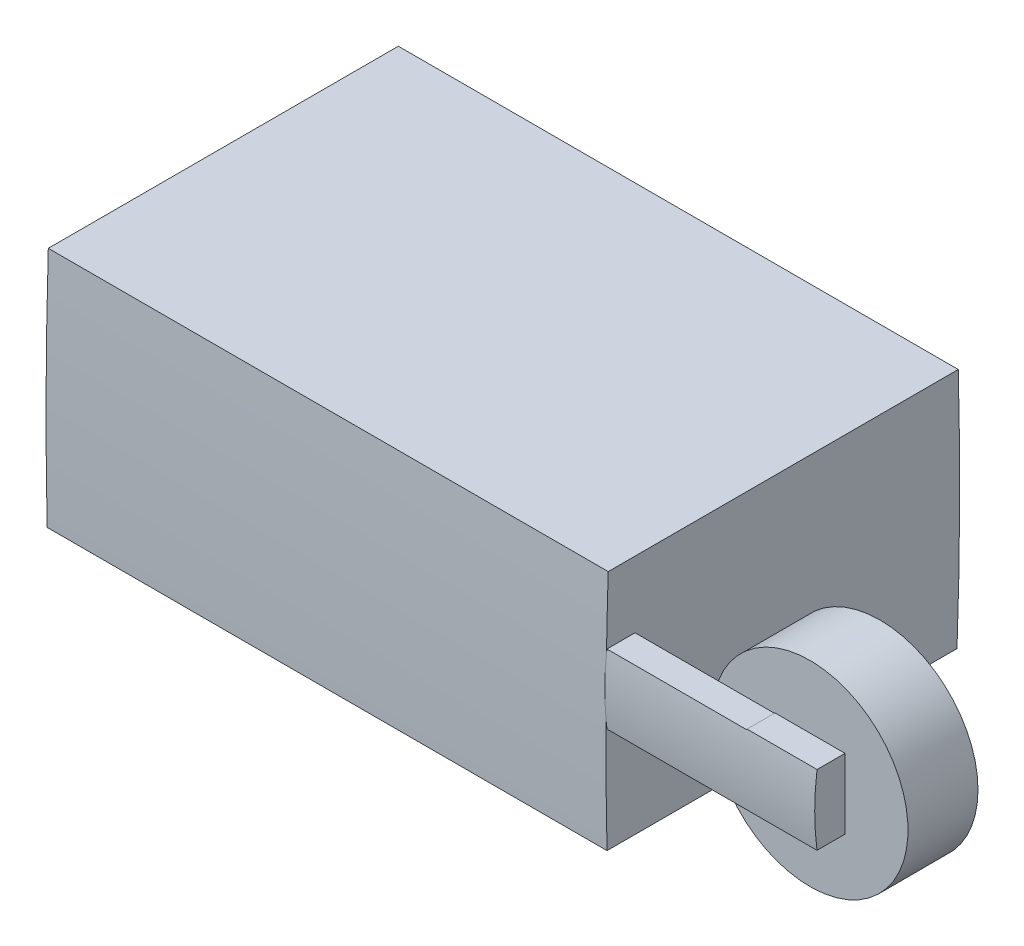
ISO-10303-21;
HEADER;
FILE_DESCRIPTION(('STEP AP214'),'2;1');
FILE_NAME('part.step','',(''),(''),'','','');
FILE_SCHEMA(('AUTOMOTIVE_DESIGN { 1 0 10303 214 1 1 1 1 }'));
ENDSEC;
DATA;
#1=APPLICATION_CONTEXT('core data for automotive mechanical design processes');
#2=APPLICATION_PROTOCOL_DEFINITION('international standard','automotive_design',2000,#1);
#3=PRODUCT_CONTEXT('',#1,'mechanical');
#4=PRODUCT('Part','Part','',(#3));
#5=PRODUCT_RELATED_PRODUCT_CATEGORY('part','',(#4));
#6=PRODUCT_DEFINITION_FORMATION('','',#4);
#7=PRODUCT_DEFINITION_CONTEXT('part definition',#1,'design');
#8=PRODUCT_DEFINITION('design','',#6,#7);
#9=PRODUCT_DEFINITION_SHAPE('','',#8);
#10=(LENGTH_UNIT() NAMED_UNIT(*) SI_UNIT(.MILLI.,.METRE.));
#11=(NAMED_UNIT(*) PLANE_ANGLE_UNIT() SI_UNIT($,.RADIAN.));
#12=(NAMED_UNIT(*) SI_UNIT($,.STERADIAN.) SOLID_ANGLE_UNIT());
#13=UNCERTAINTY_MEASURE_WITH_UNIT(LENGTH_MEASURE(1.E-05),#10,'distance_accuracy_value','');
#14=(GEOMETRIC_REPRESENTATION_CONTEXT(3) GLOBAL_UNCERTAINTY_ASSIGNED_CONTEXT((#13)) GLOBAL_UNIT_ASSIGNED_CONTEXT((#10,
#11,#12)) REPRESENTATION_CONTEXT('',''));
#15=CARTESIAN_POINT('',(0.,0.,0.));
#16=DIRECTION('',(0.,0.,1.));
#17=DIRECTION('',(1.,0.,0.));
#18=AXIS2_PLACEMENT_3D('',#15,#16,#17);
#19=CARTESIAN_POINT('',(0.,0.,10.));
#20=DIRECTION('',(0.,0.,1.));
#21=DIRECTION('',(1.,0.,0.));
#22=AXIS2_PLACEMENT_3D('',#19,#20,#21);
#23=PLANE('',#22);
#24=DIRECTION('',(1.,0.,0.));
#25=VECTOR('',#24,1.);
#26=CARTESIAN_POINT('',(-5.,-5.,10.));
#27=LINE('',#26,#25);
#28=CARTESIAN_POINT('',(-13.076696830622,-5.,10.));
#29=VERTEX_POINT('',#28);
#30=CARTESIAN_POINT('',(5.,-5.,10.));
#31=VERTEX_POINT('',#30);
#32=EDGE_CURVE('E200',#29,#31,#27,.T.);
#33=ORIENTED_EDGE('',*,*,#32,.F.);
#34=CARTESIAN_POINT('',(0.,0.,10.));
#35=DIRECTION('',(0.,0.,1.));
#36=DIRECTION('',(1.,0.,0.));
#37=AXIS2_PLACEMENT_3D('',#34,#35,#36);
#38=CIRCLE('',#37,14.);
#39=CARTESIAN_POINT('',(-13.1096817143984,4.91286528892942,10.));
#40=VERTEX_POINT('',#39);
#41=EDGE_CURVE('E220',#29,#40,#38,.T.);
#42=ORIENTED_EDGE('',*,*,#41,.T.);
#43=DIRECTION('',(1.,0.,0.));
#44=VECTOR('',#43,1.);
#45=CARTESIAN_POINT('',(-25.,4.91286528892942,10.));
#46=LINE('',#45,#44);
#47=CARTESIAN_POINT('',(-5.,4.91286528892942,10.));
#48=VERTEX_POINT('',#47);
#49=EDGE_CURVE('E183',#40,#48,#46,.T.);
#50=ORIENTED_EDGE('',*,*,#49,.T.);
#51=DIRECTION('',(0.,-1.,0.));
#52=VECTOR('',#51,1.);
#53=CARTESIAN_POINT('',(-5.,5.,10.));
#54=LINE('',#53,#52);
#55=CARTESIAN_POINT('',(-5.,5.,10.));
#56=VERTEX_POINT('',#55);
#57=EDGE_CURVE('E197',#56,#48,#54,.T.);
#58=ORIENTED_EDGE('',*,*,#57,.F.);
#59=DIRECTION('',(-1.,0.,0.));
#60=VECTOR('',#59,1.);
#61=CARTESIAN_POINT('',(-5.,5.,10.));
#62=LINE('',#61,#60);
#63=CARTESIAN_POINT('',(5.,5.,10.));
#64=VERTEX_POINT('',#63);
#65=EDGE_CURVE('E194',#64,#56,#62,.T.);
#66=ORIENTED_EDGE('',*,*,#65,.F.);
#67=DIRECTION('',(0.,1.,0.));
#68=VECTOR('',#67,1.);
#69=CARTESIAN_POINT('',(5.,5.,10.));
#70=LINE('',#69,#68);
#71=EDGE_CURVE('E191',#31,#64,#70,.T.);
#72=ORIENTED_EDGE('',*,*,#71,.F.);
#73=EDGE_LOOP('',(#33,#42,#50,#58,#66,#72));
#74=FACE_BOUND('',#73,.T.);
#75=ADVANCED_FACE('F35',(#74),#23,.T.);
#76=CARTESIAN_POINT('',(-5.,5.,18.));
#77=DIRECTION('',(1.,0.,0.));
#78=DIRECTION('',(0.,1.,0.));
#79=AXIS2_PLACEMENT_3D('',#76,#77,#78);
#80=PLANE('',#79);
#81=DIRECTION('',(0.,0.,-1.));
#82=VECTOR('',#81,1.);
#83=CARTESIAN_POINT('',(-5.,4.91286528892942,10.));
#84=LINE('',#83,#82);
#85=CARTESIAN_POINT('',(-5.,4.91286528892942,14.0114631277404));
#86=VERTEX_POINT('',#85);
#87=EDGE_CURVE('E173',#86,#48,#84,.T.);
#88=ORIENTED_EDGE('',*,*,#87,.F.);
#89=CARTESIAN_POINT('',(-5.,0.,-23.6696164036747));
#90=DIRECTION('',(1.,0.,0.));
#91=DIRECTION('',(0.,1.,0.));
#92=AXIS2_PLACEMENT_3D('',#89,#90,#91);
#93=CIRCLE('',#92,38.);
#94=CARTESIAN_POINT('',(-5.,5.,14.));
#95=VERTEX_POINT('',#94);
#96=EDGE_CURVE('E170',#86,#95,#93,.F.);
#97=ORIENTED_EDGE('',*,*,#96,.T.);
#98=DIRECTION('',(0.,0.,-1.));
#99=VECTOR('',#98,1.);
#100=CARTESIAN_POINT('',(-5.,5.,18.));
#101=LINE('',#100,#99);
#102=EDGE_CURVE('E205',#95,#56,#101,.T.);
#103=ORIENTED_EDGE('',*,*,#102,.T.);
#104=ORIENTED_EDGE('',*,*,#57,.T.);
#105=EDGE_LOOP('',(#88,#97,#103,#104));
#106=FACE_BOUND('',#105,.T.);
#107=ADVANCED_FACE('F250',(#106),#80,.F.);
#108=CARTESIAN_POINT('',(0.,0.,10.));
#109=DIRECTION('',(0.,0.,-1.));
#110=DIRECTION('',(-1.,0.,0.));
#111=AXIS2_PLACEMENT_3D('',#108,#109,#110);
#112=CYLINDRICAL_SURFACE('',#111,14.);
#113=EDGE_CURVE('E44',#40,#29,#38,.T.);
#114=ORIENTED_EDGE('',*,*,#113,.F.);
#115=ORIENTED_EDGE('',*,*,#41,.F.);
#116=EDGE_LOOP('',(#114,#115));
#117=FACE_BOUND('',#116,.T.);
#118=CARTESIAN_POINT('',(0.,0.,0.));
#119=DIRECTION('',(0.,0.,1.));
#120=DIRECTION('',(1.,0.,0.));
#121=AXIS2_PLACEMENT_3D('',#118,#119,#120);
#122=CIRCLE('',#121,14.);
#123=CARTESIAN_POINT('',(14.,0.,0.));
#124=VERTEX_POINT('',#123);
#125=EDGE_CURVE('E218',#124,#124,#122,.T.);
#126=ORIENTED_EDGE('',*,*,#125,.T.);
#127=EDGE_LOOP('',(#126));
#128=FACE_BOUND('',#127,.T.);
#129=ADVANCED_FACE('F37',(#117,#128),#112,.T.);
#130=CARTESIAN_POINT('',(0.,0.,0.));
#131=DIRECTION('',(0.,0.,1.));
#132=DIRECTION('',(1.,0.,0.));
#133=AXIS2_PLACEMENT_3D('',#130,#131,#132);
#134=PLANE('',#133);
#135=CARTESIAN_POINT('',(0.,0.,0.));
#136=DIRECTION('',(0.,0.,-1.));
#137=DIRECTION('',(-1.,0.,0.));
#138=AXIS2_PLACEMENT_3D('',#135,#136,#137);
#139=CIRCLE('',#138,5.);
#140=CARTESIAN_POINT('',(-5.,0.,0.));
#141=VERTEX_POINT('',#140);
#142=EDGE_CURVE('E209',#141,#141,#139,.T.);
#143=ORIENTED_EDGE('',*,*,#142,.F.);
#144=EDGE_LOOP('',(#143));
#145=FACE_BOUND('',#144,.T.);
#146=ORIENTED_EDGE('',*,*,#125,.F.);
#147=EDGE_LOOP('',(#146));
#148=FACE_BOUND('',#147,.T.);
#149=ADVANCED_FACE('F278',(#145,#148),#134,.F.);
#150=CARTESIAN_POINT('',(0.,0.,1.8));
#151=DIRECTION('',(0.,0.,-1.));
#152=DIRECTION('',(-1.,0.,0.));
#153=AXIS2_PLACEMENT_3D('',#150,#151,#152);
#154=PLANE('',#153);
#155=CARTESIAN_POINT('',(0.,0.,1.8));
#156=DIRECTION('',(0.,0.,-1.));
#157=DIRECTION('',(-1.,0.,0.));
#158=AXIS2_PLACEMENT_3D('',#155,#156,#157);
#159=CIRCLE('',#158,5.);
#160=CARTESIAN_POINT('',(-5.,0.,1.8));
#161=VERTEX_POINT('',#160);
#162=EDGE_CURVE('E210',#161,#161,#159,.T.);
#163=ORIENTED_EDGE('',*,*,#162,.T.);
#164=EDGE_LOOP('',(#163));
#165=FACE_BOUND('',#164,.T.);
#166=CARTESIAN_POINT('',(0.,0.,1.8));
#167=DIRECTION('',(0.,0.,-1.));
#168=DIRECTION('',(-1.,0.,0.));
#169=AXIS2_PLACEMENT_3D('',#166,#167,#168);
#170=CIRCLE('',#169,2.25);
#171=CARTESIAN_POINT('',(-2.25,0.,1.8));
#172=VERTEX_POINT('',#171);
#173=EDGE_CURVE('E39',#172,#172,#170,.F.);
#174=ORIENTED_EDGE('',*,*,#173,.T.);
#175=EDGE_LOOP('',(#174));
#176=FACE_BOUND('',#175,.T.);
#177=ADVANCED_FACE('F280',(#165,#176),#154,.T.);
#178=CARTESIAN_POINT('',(0.,0.,1.8));
#179=DIRECTION('',(0.,0.,-1.));
#180=DIRECTION('',(-1.,0.,0.));
#181=AXIS2_PLACEMENT_3D('',#178,#179,#180);
#182=CYLINDRICAL_SURFACE('',#181,5.);
#183=ORIENTED_EDGE('',*,*,#162,.F.);
#184=EDGE_LOOP('',(#183));
#185=FACE_BOUND('',#184,.T.);
#186=ORIENTED_EDGE('',*,*,#142,.T.);
#187=EDGE_LOOP('',(#186));
#188=FACE_BOUND('',#187,.T.);
#189=ADVANCED_FACE('F286',(#185,#188),#182,.F.);
#190=CARTESIAN_POINT('',(0.,0.,5.));
#191=DIRECTION('',(0.,0.,-1.));
#192=DIRECTION('',(-1.,0.,0.));
#193=AXIS2_PLACEMENT_3D('',#190,#191,#192);
#194=PLANE('',#193);
#195=CARTESIAN_POINT('',(0.,0.,5.));
#196=DIRECTION('',(0.,0.,-1.));
#197=DIRECTION('',(-1.,0.,0.));
#198=AXIS2_PLACEMENT_3D('',#195,#196,#197);
#199=CIRCLE('',#198,2.25);
#200=CARTESIAN_POINT('',(-2.25,0.,5.));
#201=VERTEX_POINT('',#200);
#202=EDGE_CURVE('E215',#201,#201,#199,.T.);
#203=ORIENTED_EDGE('',*,*,#202,.T.);
#204=EDGE_LOOP('',(#203));
#205=FACE_BOUND('',#204,.T.);
#206=ADVANCED_FACE('F293',(#205),#194,.T.);
#207=CARTESIAN_POINT('',(0.,0.,5.));
#208=DIRECTION('',(0.,0.,-1.));
#209=DIRECTION('',(-1.,0.,0.));
#210=AXIS2_PLACEMENT_3D('',#207,#208,#209);
#211=CYLINDRICAL_SURFACE('',#210,2.25);
#212=ORIENTED_EDGE('',*,*,#202,.F.);
#213=EDGE_LOOP('',(#212));
#214=FACE_BOUND('',#213,.T.);
#215=ORIENTED_EDGE('',*,*,#173,.F.);
#216=EDGE_LOOP('',(#215));
#217=FACE_BOUND('',#216,.T.);
#218=ADVANCED_FACE('F276',(#214,#217),#211,.F.);
#219=CARTESIAN_POINT('',(5.,5.,18.));
#220=DIRECTION('',(-1.,0.,0.));
#221=DIRECTION('',(0.,-1.,0.));
#222=AXIS2_PLACEMENT_3D('',#219,#220,#221);
#223=PLANE('',#222);
#224=DIRECTION('',(0.,0.,-1.));
#225=VECTOR('',#224,1.);
#226=CARTESIAN_POINT('',(5.,5.,18.));
#227=LINE('',#226,#225);
#228=CARTESIAN_POINT('',(5.,5.,14.));
#229=VERTEX_POINT('',#228);
#230=EDGE_CURVE('E207',#229,#64,#227,.T.);
#231=ORIENTED_EDGE('',*,*,#230,.F.);
#232=CARTESIAN_POINT('',(5.,0.,-23.6696164036747));
#233=DIRECTION('',(-1.,0.,0.));
#234=DIRECTION('',(0.,-1.,0.));
#235=AXIS2_PLACEMENT_3D('',#232,#233,#234);
#236=CIRCLE('',#235,38.);
#237=CARTESIAN_POINT('',(5.,-5.,14.));
#238=VERTEX_POINT('',#237);
#239=EDGE_CURVE('E152',#238,#229,#236,.T.);
#240=ORIENTED_EDGE('',*,*,#239,.F.);
#241=DIRECTION('',(0.,0.,-1.));
#242=VECTOR('',#241,1.);
#243=CARTESIAN_POINT('',(5.,-5.,18.));
#244=LINE('',#243,#242);
#245=EDGE_CURVE('E203',#238,#31,#244,.T.);
#246=ORIENTED_EDGE('',*,*,#245,.T.);
#247=ORIENTED_EDGE('',*,*,#71,.T.);
#248=EDGE_LOOP('',(#231,#240,#246,#247));
#249=FACE_BOUND('',#248,.T.);
#250=ADVANCED_FACE('F258',(#249),#223,.F.);
#251=CARTESIAN_POINT('',(-5.,5.,18.));
#252=DIRECTION('',(0.,-1.,0.));
#253=DIRECTION('',(0.,0.,-1.));
#254=AXIS2_PLACEMENT_3D('',#251,#252,#253);
#255=PLANE('',#254);
#256=ORIENTED_EDGE('',*,*,#102,.F.);
#257=DIRECTION('',(1.,0.,0.));
#258=VECTOR('',#257,1.);
#259=CARTESIAN_POINT('',(-25.,5.,14.));
#260=LINE('',#259,#258);
#261=EDGE_CURVE('E165',#95,#229,#260,.T.);
#262=ORIENTED_EDGE('',*,*,#261,.T.);
#263=ORIENTED_EDGE('',*,*,#230,.T.);
#264=ORIENTED_EDGE('',*,*,#65,.T.);
#265=EDGE_LOOP('',(#256,#262,#263,#264));
#266=FACE_BOUND('',#265,.T.);
#267=ADVANCED_FACE('F254',(#266),#255,.F.);
#268=CARTESIAN_POINT('',(-5.,-5.,18.));
#269=DIRECTION('',(0.,1.,0.));
#270=DIRECTION('',(0.,0.,1.));
#271=AXIS2_PLACEMENT_3D('',#268,#269,#270);
#272=PLANE('',#271);
#273=ORIENTED_EDGE('',*,*,#245,.F.);
#274=DIRECTION('',(1.,0.,0.));
#275=VECTOR('',#274,1.);
#276=CARTESIAN_POINT('',(-25.,-5.,14.));
#277=LINE('',#276,#275);
#278=CARTESIAN_POINT('',(-25.,-5.,14.));
#279=VERTEX_POINT('',#278);
#280=EDGE_CURVE('E162',#279,#238,#277,.T.);
#281=ORIENTED_EDGE('',*,*,#280,.F.);
#282=DIRECTION('',(0.,0.,1.));
#283=VECTOR('',#282,1.);
#284=CARTESIAN_POINT('',(-25.,-5.,10.));
#285=LINE('',#284,#283);
#286=CARTESIAN_POINT('',(-25.,-5.,10.));
#287=VERTEX_POINT('',#286);
#288=EDGE_CURVE('E177',#287,#279,#285,.T.);
#289=ORIENTED_EDGE('',*,*,#288,.F.);
#290=DIRECTION('',(1.,0.,0.));
#291=VECTOR('',#290,1.);
#292=CARTESIAN_POINT('',(-25.,-5.,10.));
#293=LINE('',#292,#291);
#294=EDGE_CURVE('E188',#287,#29,#293,.T.);
#295=ORIENTED_EDGE('',*,*,#294,.T.);
#296=ORIENTED_EDGE('',*,*,#32,.T.);
#297=EDGE_LOOP('',(#273,#281,#289,#295,#296));
#298=FACE_BOUND('',#297,.T.);
#299=ADVANCED_FACE('F238',(#298),#272,.F.);
#300=CARTESIAN_POINT('',(-25.,4.91286528892942,10.));
#301=DIRECTION('',(0.,0.,1.));
#302=DIRECTION('',(1.,0.,0.));
#303=AXIS2_PLACEMENT_3D('',#300,#301,#302);
#304=PLANE('',#303);
#305=CARTESIAN_POINT('',(-25.,4.91286528892942,10.));
#306=VERTEX_POINT('',#305);
#307=EDGE_CURVE('E185',#306,#40,#46,.T.);
#308=ORIENTED_EDGE('',*,*,#307,.T.);
#309=ORIENTED_EDGE('',*,*,#113,.T.);
#310=ORIENTED_EDGE('',*,*,#294,.F.);
#311=DIRECTION('',(0.,-1.,0.));
#312=VECTOR('',#311,1.);
#313=CARTESIAN_POINT('',(-25.,4.91286528892942,10.));
#314=LINE('',#313,#312);
#315=EDGE_CURVE('E174',#306,#287,#314,.T.);
#316=ORIENTED_EDGE('',*,*,#315,.F.);
#317=EDGE_LOOP('',(#308,#309,#310,#316));
#318=FACE_BOUND('',#317,.T.);
#319=ADVANCED_FACE('F234',(#318),#304,.F.);
#320=CARTESIAN_POINT('',(-25.,4.91286528892942,10.));
#321=DIRECTION('',(0.,-1.,0.));
#322=DIRECTION('',(1.,0.,0.));
#323=AXIS2_PLACEMENT_3D('',#320,#321,#322);
#324=PLANE('',#323);
#325=DIRECTION('',(0.,0.,-1.));
#326=VECTOR('',#325,1.);
#327=CARTESIAN_POINT('',(-25.,4.91286528892942,10.));
#328=LINE('',#327,#326);
#329=CARTESIAN_POINT('',(-25.,4.91286528892942,14.0114631277404));
#330=VERTEX_POINT('',#329);
#331=EDGE_CURVE('E180',#330,#306,#328,.T.);
#332=ORIENTED_EDGE('',*,*,#331,.F.);
#333=DIRECTION('',(1.,0.,0.));
#334=VECTOR('',#333,1.);
#335=CARTESIAN_POINT('',(-25.,4.91286528892942,14.0114631277404));
#336=LINE('',#335,#334);
#337=EDGE_CURVE('E59',#330,#86,#336,.T.);
#338=ORIENTED_EDGE('',*,*,#337,.T.);
#339=ORIENTED_EDGE('',*,*,#87,.T.);
#340=ORIENTED_EDGE('',*,*,#49,.F.);
#341=ORIENTED_EDGE('',*,*,#307,.F.);
#342=EDGE_LOOP('',(#332,#338,#339,#340,#341));
#343=FACE_BOUND('',#342,.T.);
#344=ADVANCED_FACE('F247',(#343),#324,.F.);
#345=CARTESIAN_POINT('',(-25.,0.,0.));
#346=DIRECTION('',(-1.,0.,0.));
#347=DIRECTION('',(0.,-1.,0.));
#348=AXIS2_PLACEMENT_3D('',#345,#346,#347);
#349=PLANE('',#348);
#350=CARTESIAN_POINT('',(-25.,-5.83938739683854,-602.069122819706));
#351=DIRECTION('',(-1.,0.,0.));
#352=DIRECTION('',(0.,1.,0.));
#353=AXIS2_PLACEMENT_3D('',#350,#351,#352);
#354=CIRCLE('',#353,616.232847891234);
#355=CARTESIAN_POINT('',(-25.,-3.5981456585402,14.1596493547289));
#356=VERTEX_POINT('',#355);
#357=CARTESIAN_POINT('',(-25.,4.36116541292893,14.0792939943893));
#358=VERTEX_POINT('',#357);
#359=EDGE_CURVE('E11',#356,#358,#354,.T.);
#360=ORIENTED_EDGE('',*,*,#359,.F.);
#361=CARTESIAN_POINT('',(-25.,0.,-23.6696164036747));
#362=DIRECTION('',(-1.,0.,0.));
#363=DIRECTION('',(0.,-1.,0.));
#364=AXIS2_PLACEMENT_3D('',#361,#362,#363);
#365=CIRCLE('',#364,38.);
#366=EDGE_CURVE('E163',#356,#358,#365,.T.);
#367=ORIENTED_EDGE('',*,*,#366,.T.);
#368=EDGE_LOOP('',(#360,#367));
#369=FACE_BOUND('',#368,.T.);
#370=ADVANCED_FACE('F260',(#369),#349,.T.);
#371=CARTESIAN_POINT('',(-25.,0.,-23.6696164036747));
#372=DIRECTION('',(1.,0.,0.));
#373=DIRECTION('',(0.,1.,0.));
#374=AXIS2_PLACEMENT_3D('',#371,#372,#373);
#375=CYLINDRICAL_SURFACE('',#374,38.);
#376=ORIENTED_EDGE('',*,*,#337,.F.);
#377=EDGE_CURVE('E154',#358,#330,#365,.T.);
#378=ORIENTED_EDGE('',*,*,#377,.F.);
#379=ORIENTED_EDGE('',*,*,#366,.F.);
#380=EDGE_CURVE('E160',#279,#356,#365,.T.);
#381=ORIENTED_EDGE('',*,*,#380,.F.);
#382=ORIENTED_EDGE('',*,*,#280,.T.);
#383=ORIENTED_EDGE('',*,*,#239,.T.);
#384=ORIENTED_EDGE('',*,*,#261,.F.);
#385=ORIENTED_EDGE('',*,*,#96,.F.);
#386=EDGE_LOOP('',(#376,#378,#379,#381,#382,#383,#384,#385));
#387=FACE_BOUND('',#386,.T.);
#388=ADVANCED_FACE('F259',(#387),#375,.T.);
#389=CARTESIAN_POINT('',(-105.,-0.0435673555353119,494.316933782292));
#390=DIRECTION('',(1.,0.,0.));
#391=DIRECTION('',(0.,1.,0.));
#392=AXIS2_PLACEMENT_3D('',#389,#390,#391);
#393=CYLINDRICAL_SURFACE('',#392,530.693932748672);
#394=CARTESIAN_POINT('',(-25.,-0.0435673555352979,494.316933782292));
#395=DIRECTION('',(-1.,0.,0.));
#396=DIRECTION('',(0.,1.,0.));
#397=AXIS2_PLACEMENT_3D('',#394,#395,#396);
#398=CIRCLE('',#397,530.693932748672);
#399=CARTESIAN_POINT('',(-25.,14.4035859028628,-36.1803141078174));
#400=VERTEX_POINT('',#399);
#401=CARTESIAN_POINT('',(-25.,-20.0435673555353,-36.));
#402=VERTEX_POINT('',#401);
#403=EDGE_CURVE('E151',#400,#402,#398,.T.);
#404=ORIENTED_EDGE('',*,*,#403,.T.);
#405=DIRECTION('',(1.,0.,0.));
#406=VECTOR('',#405,1.);
#407=CARTESIAN_POINT('',(-105.,-20.0435673555353,-36.));
#408=LINE('',#407,#406);
#409=CARTESIAN_POINT('',(-105.,-20.0435673555353,-36.));
#410=VERTEX_POINT('',#409);
#411=EDGE_CURVE('E131',#410,#402,#408,.T.);
#412=ORIENTED_EDGE('',*,*,#411,.F.);
#413=CARTESIAN_POINT('',(-105.,-0.0435673555353119,494.316933782292));
#414=DIRECTION('',(-1.,0.,0.));
#415=DIRECTION('',(0.,1.,0.));
#416=AXIS2_PLACEMENT_3D('',#413,#414,#415);
#417=CIRCLE('',#416,530.693932748672);
#418=CARTESIAN_POINT('',(-105.,14.4035859028628,-36.1803141078174));
#419=VERTEX_POINT('',#418);
#420=EDGE_CURVE('E138',#419,#410,#417,.T.);
#421=ORIENTED_EDGE('',*,*,#420,.F.);
#422=DIRECTION('',(1.,0.,0.));
#423=VECTOR('',#422,1.);
#424=CARTESIAN_POINT('',(-105.,14.4035859028628,-36.1803141078174));
#425=LINE('',#424,#423);
#426=EDGE_CURVE('E385',#419,#400,#425,.T.);
#427=ORIENTED_EDGE('',*,*,#426,.T.);
#428=EDGE_LOOP('',(#404,#412,#421,#427));
#429=FACE_BOUND('',#428,.T.);
#430=ADVANCED_FACE('F149',(#429),#393,.T.);
#431=CARTESIAN_POINT('',(-105.,-20.0435673555353,-36.));
#432=DIRECTION('',(0.,1.,0.));
#433=DIRECTION('',(-1.,0.,0.));
#434=AXIS2_PLACEMENT_3D('',#431,#432,#433);
#435=PLANE('',#434);
#436=DIRECTION('',(0.,0.,1.));
#437=VECTOR('',#436,1.);
#438=CARTESIAN_POINT('',(-25.,-20.0435673555353,-36.));
#439=LINE('',#438,#437);
#440=CARTESIAN_POINT('',(-25.,-20.0435673555353,14.));
#441=VERTEX_POINT('',#440);
#442=EDGE_CURVE('E389',#402,#441,#439,.T.);
#443=ORIENTED_EDGE('',*,*,#442,.T.);
#444=DIRECTION('',(1.,0.,0.));
#445=VECTOR('',#444,1.);
#446=CARTESIAN_POINT('',(-105.,-20.0435673555353,14.));
#447=LINE('',#446,#445);
#448=CARTESIAN_POINT('',(-105.,-20.0435673555353,14.));
#449=VERTEX_POINT('',#448);
#450=EDGE_CURVE('E134',#449,#441,#447,.T.);
#451=ORIENTED_EDGE('',*,*,#450,.F.);
#452=DIRECTION('',(0.,0.,1.));
#453=VECTOR('',#452,1.);
#454=CARTESIAN_POINT('',(-105.,-20.0435673555353,-36.));
#455=LINE('',#454,#453);
#456=EDGE_CURVE('E127',#410,#449,#455,.T.);
#457=ORIENTED_EDGE('',*,*,#456,.F.);
#458=ORIENTED_EDGE('',*,*,#411,.T.);
#459=EDGE_LOOP('',(#443,#451,#457,#458));
#460=FACE_BOUND('',#459,.T.);
#461=ADVANCED_FACE('F129',(#460),#435,.F.);
#462=CARTESIAN_POINT('',(-105.,-5.83938739683855,-602.069122819706));
#463=DIRECTION('',(1.,0.,0.));
#464=DIRECTION('',(0.,1.,0.));
#465=AXIS2_PLACEMENT_3D('',#462,#463,#464);
#466=CYLINDRICAL_SURFACE('',#465,616.232847891234);
#467=EDGE_CURVE('E46',#441,#356,#354,.T.);
#468=ORIENTED_EDGE('',*,*,#467,.T.);
#469=ORIENTED_EDGE('',*,*,#359,.T.);
#470=CARTESIAN_POINT('',(-25.,14.4035859028628,13.8311490199229));
#471=VERTEX_POINT('',#470);
#472=EDGE_CURVE('E47',#358,#471,#354,.T.);
#473=ORIENTED_EDGE('',*,*,#472,.T.);
#474=DIRECTION('',(1.,0.,0.));
#475=VECTOR('',#474,1.);
#476=CARTESIAN_POINT('',(-105.,14.4035859028628,13.8311490199229));
#477=LINE('',#476,#475);
#478=CARTESIAN_POINT('',(-105.,14.4035859028628,13.8311490199229));
#479=VERTEX_POINT('',#478);
#480=EDGE_CURVE('E156',#479,#471,#477,.T.);
#481=ORIENTED_EDGE('',*,*,#480,.F.);
#482=CARTESIAN_POINT('',(-105.,-5.83938739683855,-602.069122819706));
#483=DIRECTION('',(-1.,0.,0.));
#484=DIRECTION('',(0.,1.,0.));
#485=AXIS2_PLACEMENT_3D('',#482,#483,#484);
#486=CIRCLE('',#485,616.232847891234);
#487=EDGE_CURVE('E137',#449,#479,#486,.T.);
#488=ORIENTED_EDGE('',*,*,#487,.F.);
#489=ORIENTED_EDGE('',*,*,#450,.T.);
#490=EDGE_LOOP('',(#468,#469,#473,#481,#488,#489));
#491=FACE_BOUND('',#490,.T.);
#492=ADVANCED_FACE('F344',(#491),#466,.T.);
#493=CARTESIAN_POINT('',(-105.,14.4035859028628,-36.1803141078174));
#494=DIRECTION('',(0.,-1.,0.));
#495=DIRECTION('',(1.,0.,0.));
#496=AXIS2_PLACEMENT_3D('',#493,#494,#495);
#497=PLANE('',#496);
#498=DIRECTION('',(0.,0.,-1.));
#499=VECTOR('',#498,1.);
#500=CARTESIAN_POINT('',(-25.,14.4035859028628,-36.1803141078174));
#501=LINE('',#500,#499);
#502=EDGE_CURVE('E147',#471,#400,#501,.T.);
#503=ORIENTED_EDGE('',*,*,#502,.T.);
#504=ORIENTED_EDGE('',*,*,#426,.F.);
#505=DIRECTION('',(0.,0.,-1.));
#506=VECTOR('',#505,1.);
#507=CARTESIAN_POINT('',(-105.,14.4035859028628,-36.1803141078174));
#508=LINE('',#507,#506);
#509=EDGE_CURVE('E143',#479,#419,#508,.T.);
#510=ORIENTED_EDGE('',*,*,#509,.F.);
#511=ORIENTED_EDGE('',*,*,#480,.T.);
#512=EDGE_LOOP('',(#503,#504,#510,#511));
#513=FACE_BOUND('',#512,.T.);
#514=ADVANCED_FACE('F353',(#513),#497,.F.);
#515=CARTESIAN_POINT('',(-105.,-0.0435673555353119,494.316933782292));
#516=DIRECTION('',(1.,0.,0.));
#517=DIRECTION('',(0.,1.,0.));
#518=AXIS2_PLACEMENT_3D('',#515,#516,#517);
#519=PLANE('',#518);
#520=ORIENTED_EDGE('',*,*,#420,.T.);
#521=ORIENTED_EDGE('',*,*,#456,.T.);
#522=ORIENTED_EDGE('',*,*,#487,.T.);
#523=ORIENTED_EDGE('',*,*,#509,.T.);
#524=EDGE_LOOP('',(#520,#521,#522,#523));
#525=FACE_BOUND('',#524,.T.);
#526=ADVANCED_FACE('F141',(#525),#519,.F.);
#527=CARTESIAN_POINT('',(-25.,-0.0435673555352979,494.316933782292));
#528=DIRECTION('',(1.,0.,0.));
#529=DIRECTION('',(0.,1.,0.));
#530=AXIS2_PLACEMENT_3D('',#527,#528,#529);
#531=PLANE('',#530);
#532=ORIENTED_EDGE('',*,*,#288,.T.);
#533=ORIENTED_EDGE('',*,*,#380,.T.);
#534=ORIENTED_EDGE('',*,*,#467,.F.);
#535=ORIENTED_EDGE('',*,*,#442,.F.);
#536=ORIENTED_EDGE('',*,*,#403,.F.);
#537=ORIENTED_EDGE('',*,*,#502,.F.);
#538=ORIENTED_EDGE('',*,*,#472,.F.);
#539=ORIENTED_EDGE('',*,*,#377,.T.);
#540=ORIENTED_EDGE('',*,*,#331,.T.);
#541=ORIENTED_EDGE('',*,*,#315,.T.);
#542=EDGE_LOOP('',(#532,#533,#534,#535,#536,#537,#538,#539,#540,#541));
#543=FACE_BOUND('',#542,.T.);
#544=ADVANCED_FACE('F241',(#543),#531,.T.);
#545=CLOSED_SHELL('',(#75,#107,#129,#149,#177,#189,#206,#218,#250,#267,#299,#319,#344,#370,#388,
#430,#461,#492,#514,#526,#544));
#546=MANIFOLD_SOLID_BREP('B2',#545);
#547=ADVANCED_BREP_SHAPE_REPRESENTATION('',(#18,#546),#14);
#548=SHAPE_DEFINITION_REPRESENTATION(#9,#547);
ENDSEC;
END-ISO-10303-21;
